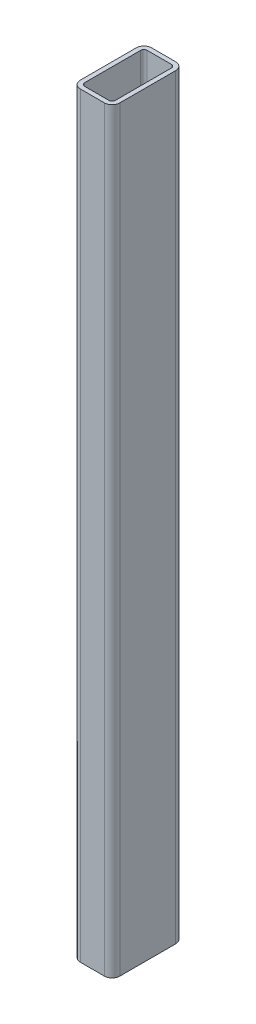
ISO-10303-21;
HEADER;
FILE_DESCRIPTION(('STEP AP214'),'2;1');
FILE_NAME('part.step','',(''),(''),'','','');
FILE_SCHEMA(('AUTOMOTIVE_DESIGN { 1 0 10303 214 1 1 1 1 }'));
ENDSEC;
DATA;
#1=APPLICATION_CONTEXT('core data for automotive mechanical design processes');
#2=APPLICATION_PROTOCOL_DEFINITION('international standard','automotive_design',2000,#1);
#3=PRODUCT_CONTEXT('',#1,'mechanical');
#4=PRODUCT('Part','Part','',(#3));
#5=PRODUCT_RELATED_PRODUCT_CATEGORY('part','',(#4));
#6=PRODUCT_DEFINITION_FORMATION('','',#4);
#7=PRODUCT_DEFINITION_CONTEXT('part definition',#1,'design');
#8=PRODUCT_DEFINITION('design','',#6,#7);
#9=PRODUCT_DEFINITION_SHAPE('','',#8);
#10=(LENGTH_UNIT() NAMED_UNIT(*) SI_UNIT(.MILLI.,.METRE.));
#11=(NAMED_UNIT(*) PLANE_ANGLE_UNIT() SI_UNIT($,.RADIAN.));
#12=(NAMED_UNIT(*) SI_UNIT($,.STERADIAN.) SOLID_ANGLE_UNIT());
#13=UNCERTAINTY_MEASURE_WITH_UNIT(LENGTH_MEASURE(1.E-05),#10,'distance_accuracy_value','');
#14=(GEOMETRIC_REPRESENTATION_CONTEXT(3) GLOBAL_UNCERTAINTY_ASSIGNED_CONTEXT((#13)) GLOBAL_UNIT_ASSIGNED_CONTEXT((#10,
#11,#12)) REPRESENTATION_CONTEXT('',''));
#15=CARTESIAN_POINT('',(0.,0.,0.));
#16=DIRECTION('',(0.,0.,1.));
#17=DIRECTION('',(1.,0.,0.));
#18=AXIS2_PLACEMENT_3D('',#15,#16,#17);
#19=CARTESIAN_POINT('',(5.5,345.,-12.75));
#20=DIRECTION('',(0.,1.,0.));
#21=DIRECTION('',(0.,0.,1.));
#22=AXIS2_PLACEMENT_3D('',#19,#20,#21);
#23=PLANE('',#22);
#24=CARTESIAN_POINT('',(5.5,345.,-12.75));
#25=DIRECTION('',(0.,1.,0.));
#26=DIRECTION('',(1.,0.,0.));
#27=AXIS2_PLACEMENT_3D('',#24,#25,#26);
#28=CIRCLE('',#27,3.5);
#29=CARTESIAN_POINT('',(9.,345.,-12.75));
#30=VERTEX_POINT('',#29);
#31=CARTESIAN_POINT('',(5.5,345.,-16.25));
#32=VERTEX_POINT('',#31);
#33=EDGE_CURVE('E258',#30,#32,#28,.T.);
#34=ORIENTED_EDGE('',*,*,#33,.T.);
#35=DIRECTION('',(-1.,0.,0.));
#36=VECTOR('',#35,1.);
#37=CARTESIAN_POINT('',(-5.5,345.,-16.25));
#38=LINE('',#37,#36);
#39=CARTESIAN_POINT('',(-5.5,345.,-16.25));
#40=VERTEX_POINT('',#39);
#41=EDGE_CURVE('E261',#32,#40,#38,.T.);
#42=ORIENTED_EDGE('',*,*,#41,.T.);
#43=CARTESIAN_POINT('',(-5.5,345.,-12.75));
#44=DIRECTION('',(0.,1.,0.));
#45=DIRECTION('',(1.,0.,0.));
#46=AXIS2_PLACEMENT_3D('',#43,#44,#45);
#47=CIRCLE('',#46,3.5);
#48=CARTESIAN_POINT('',(-9.,345.,-12.75));
#49=VERTEX_POINT('',#48);
#50=EDGE_CURVE('E264',#40,#49,#47,.T.);
#51=ORIENTED_EDGE('',*,*,#50,.T.);
#52=DIRECTION('',(0.,0.,1.));
#53=VECTOR('',#52,1.);
#54=CARTESIAN_POINT('',(-9.,345.,-12.75));
#55=LINE('',#54,#53);
#56=CARTESIAN_POINT('',(-9.,345.,12.75));
#57=VERTEX_POINT('',#56);
#58=EDGE_CURVE('E266',#49,#57,#55,.T.);
#59=ORIENTED_EDGE('',*,*,#58,.T.);
#60=CARTESIAN_POINT('',(-5.5,345.,12.75));
#61=DIRECTION('',(0.,1.,0.));
#62=DIRECTION('',(1.,0.,0.));
#63=AXIS2_PLACEMENT_3D('',#60,#61,#62);
#64=CIRCLE('',#63,3.5);
#65=CARTESIAN_POINT('',(-5.5,345.,16.25));
#66=VERTEX_POINT('',#65);
#67=EDGE_CURVE('E268',#57,#66,#64,.T.);
#68=ORIENTED_EDGE('',*,*,#67,.T.);
#69=DIRECTION('',(1.,0.,0.));
#70=VECTOR('',#69,1.);
#71=CARTESIAN_POINT('',(-5.5,345.,16.25));
#72=LINE('',#71,#70);
#73=CARTESIAN_POINT('',(5.50000000000001,345.,16.25));
#74=VERTEX_POINT('',#73);
#75=EDGE_CURVE('E270',#66,#74,#72,.T.);
#76=ORIENTED_EDGE('',*,*,#75,.T.);
#77=CARTESIAN_POINT('',(5.5,345.,12.75));
#78=DIRECTION('',(0.,1.,0.));
#79=DIRECTION('',(1.,0.,0.));
#80=AXIS2_PLACEMENT_3D('',#77,#78,#79);
#81=CIRCLE('',#80,3.5);
#82=CARTESIAN_POINT('',(9.00000000000001,345.,12.75));
#83=VERTEX_POINT('',#82);
#84=EDGE_CURVE('E272',#74,#83,#81,.T.);
#85=ORIENTED_EDGE('',*,*,#84,.T.);
#86=DIRECTION('',(0.,0.,-1.));
#87=VECTOR('',#86,1.);
#88=CARTESIAN_POINT('',(9.,345.,-12.75));
#89=LINE('',#88,#87);
#90=EDGE_CURVE('E274',#83,#30,#89,.T.);
#91=ORIENTED_EDGE('',*,*,#90,.T.);
#92=EDGE_LOOP('',(#34,#42,#51,#59,#68,#76,#85,#91));
#93=FACE_BOUND('',#92,.T.);
#94=DIRECTION('',(-1.,0.,0.));
#95=VECTOR('',#94,1.);
#96=CARTESIAN_POINT('',(-5.5,345.,-14.25));
#97=LINE('',#96,#95);
#98=CARTESIAN_POINT('',(5.5,345.,-14.25));
#99=VERTEX_POINT('',#98);
#100=CARTESIAN_POINT('',(-5.5,345.,-14.25));
#101=VERTEX_POINT('',#100);
#102=EDGE_CURVE('E201',#99,#101,#97,.T.);
#103=ORIENTED_EDGE('',*,*,#102,.F.);
#104=CARTESIAN_POINT('',(5.5,345.,-12.75));
#105=DIRECTION('',(0.,1.,0.));
#106=DIRECTION('',(0.,0.,1.));
#107=AXIS2_PLACEMENT_3D('',#104,#105,#106);
#108=CIRCLE('',#107,1.5);
#109=CARTESIAN_POINT('',(7.,345.,-12.75));
#110=VERTEX_POINT('',#109);
#111=EDGE_CURVE('E193',#110,#99,#108,.T.);
#112=ORIENTED_EDGE('',*,*,#111,.F.);
#113=DIRECTION('',(0.,0.,-1.));
#114=VECTOR('',#113,1.);
#115=CARTESIAN_POINT('',(7.,345.,-12.75));
#116=LINE('',#115,#114);
#117=CARTESIAN_POINT('',(7.,345.,12.75));
#118=VERTEX_POINT('',#117);
#119=EDGE_CURVE('E226',#118,#110,#116,.T.);
#120=ORIENTED_EDGE('',*,*,#119,.F.);
#121=CARTESIAN_POINT('',(5.5,345.,12.75));
#122=DIRECTION('',(0.,1.,0.));
#123=DIRECTION('',(0.,0.,-1.));
#124=AXIS2_PLACEMENT_3D('',#121,#122,#123);
#125=CIRCLE('',#124,1.5);
#126=CARTESIAN_POINT('',(5.5,345.,14.25));
#127=VERTEX_POINT('',#126);
#128=EDGE_CURVE('E224',#127,#118,#125,.T.);
#129=ORIENTED_EDGE('',*,*,#128,.F.);
#130=DIRECTION('',(1.,0.,0.));
#131=VECTOR('',#130,1.);
#132=CARTESIAN_POINT('',(-5.5,345.,14.25));
#133=LINE('',#132,#131);
#134=CARTESIAN_POINT('',(-5.5,345.,14.25));
#135=VERTEX_POINT('',#134);
#136=EDGE_CURVE('E222',#135,#127,#133,.T.);
#137=ORIENTED_EDGE('',*,*,#136,.F.);
#138=CARTESIAN_POINT('',(-5.5,345.,12.75));
#139=DIRECTION('',(0.,1.,0.));
#140=DIRECTION('',(0.,0.,-1.));
#141=AXIS2_PLACEMENT_3D('',#138,#139,#140);
#142=CIRCLE('',#141,1.5);
#143=CARTESIAN_POINT('',(-7.,345.,12.75));
#144=VERTEX_POINT('',#143);
#145=EDGE_CURVE('E220',#144,#135,#142,.T.);
#146=ORIENTED_EDGE('',*,*,#145,.F.);
#147=DIRECTION('',(0.,0.,1.));
#148=VECTOR('',#147,1.);
#149=CARTESIAN_POINT('',(-7.,345.,-12.75));
#150=LINE('',#149,#148);
#151=CARTESIAN_POINT('',(-7.,345.,-12.75));
#152=VERTEX_POINT('',#151);
#153=EDGE_CURVE('E216',#152,#144,#150,.T.);
#154=ORIENTED_EDGE('',*,*,#153,.F.);
#155=CARTESIAN_POINT('',(-5.5,345.,-12.75));
#156=DIRECTION('',(0.,1.,0.));
#157=DIRECTION('',(0.,0.,1.));
#158=AXIS2_PLACEMENT_3D('',#155,#156,#157);
#159=CIRCLE('',#158,1.5);
#160=EDGE_CURVE('E214',#101,#152,#159,.T.);
#161=ORIENTED_EDGE('',*,*,#160,.F.);
#162=EDGE_LOOP('',(#103,#112,#120,#129,#137,#146,#154,#161));
#163=FACE_BOUND('',#162,.T.);
#164=ADVANCED_FACE('F80',(#93,#163),#23,.T.);
#165=CARTESIAN_POINT('',(5.5,0.,-12.75));
#166=DIRECTION('',(0.,1.,0.));
#167=DIRECTION('',(0.,0.,1.));
#168=AXIS2_PLACEMENT_3D('',#165,#166,#167);
#169=PLANE('',#168);
#170=CARTESIAN_POINT('',(5.5,0.,-12.75));
#171=DIRECTION('',(0.,1.,0.));
#172=DIRECTION('',(1.,0.,0.));
#173=AXIS2_PLACEMENT_3D('',#170,#171,#172);
#174=CIRCLE('',#173,3.5);
#175=CARTESIAN_POINT('',(9.,0.,-12.75));
#176=VERTEX_POINT('',#175);
#177=CARTESIAN_POINT('',(5.5,0.,-16.25));
#178=VERTEX_POINT('',#177);
#179=EDGE_CURVE('E209',#176,#178,#174,.T.);
#180=ORIENTED_EDGE('',*,*,#179,.F.);
#181=DIRECTION('',(0.,0.,-1.));
#182=VECTOR('',#181,1.);
#183=CARTESIAN_POINT('',(9.,0.,-12.75));
#184=LINE('',#183,#182);
#185=CARTESIAN_POINT('',(9.00000000000001,0.,12.75));
#186=VERTEX_POINT('',#185);
#187=EDGE_CURVE('E262',#186,#176,#184,.T.);
#188=ORIENTED_EDGE('',*,*,#187,.F.);
#189=CARTESIAN_POINT('',(5.5,0.,12.75));
#190=DIRECTION('',(0.,1.,0.));
#191=DIRECTION('',(1.,0.,0.));
#192=AXIS2_PLACEMENT_3D('',#189,#190,#191);
#193=CIRCLE('',#192,3.5);
#194=CARTESIAN_POINT('',(5.50000000000001,0.,16.25));
#195=VERTEX_POINT('',#194);
#196=EDGE_CURVE('E289',#195,#186,#193,.T.);
#197=ORIENTED_EDGE('',*,*,#196,.F.);
#198=DIRECTION('',(1.,0.,0.));
#199=VECTOR('',#198,1.);
#200=CARTESIAN_POINT('',(-5.5,0.,16.25));
#201=LINE('',#200,#199);
#202=CARTESIAN_POINT('',(-5.5,0.,16.25));
#203=VERTEX_POINT('',#202);
#204=EDGE_CURVE('E287',#203,#195,#201,.T.);
#205=ORIENTED_EDGE('',*,*,#204,.F.);
#206=CARTESIAN_POINT('',(-5.5,0.,12.75));
#207=DIRECTION('',(0.,1.,0.));
#208=DIRECTION('',(1.,0.,0.));
#209=AXIS2_PLACEMENT_3D('',#206,#207,#208);
#210=CIRCLE('',#209,3.5);
#211=CARTESIAN_POINT('',(-9.,0.,12.75));
#212=VERTEX_POINT('',#211);
#213=EDGE_CURVE('E285',#212,#203,#210,.T.);
#214=ORIENTED_EDGE('',*,*,#213,.F.);
#215=DIRECTION('',(0.,0.,1.));
#216=VECTOR('',#215,1.);
#217=CARTESIAN_POINT('',(-9.,0.,-12.75));
#218=LINE('',#217,#216);
#219=CARTESIAN_POINT('',(-9.,0.,-12.75));
#220=VERTEX_POINT('',#219);
#221=EDGE_CURVE('E283',#220,#212,#218,.T.);
#222=ORIENTED_EDGE('',*,*,#221,.F.);
#223=CARTESIAN_POINT('',(-5.5,0.,-12.75));
#224=DIRECTION('',(0.,1.,0.));
#225=DIRECTION('',(1.,0.,0.));
#226=AXIS2_PLACEMENT_3D('',#223,#224,#225);
#227=CIRCLE('',#226,3.5);
#228=CARTESIAN_POINT('',(-5.5,0.,-16.25));
#229=VERTEX_POINT('',#228);
#230=EDGE_CURVE('E281',#229,#220,#227,.T.);
#231=ORIENTED_EDGE('',*,*,#230,.F.);
#232=DIRECTION('',(-1.,0.,0.));
#233=VECTOR('',#232,1.);
#234=CARTESIAN_POINT('',(-5.5,0.,-16.25));
#235=LINE('',#234,#233);
#236=EDGE_CURVE('E279',#178,#229,#235,.T.);
#237=ORIENTED_EDGE('',*,*,#236,.F.);
#238=EDGE_LOOP('',(#180,#188,#197,#205,#214,#222,#231,#237));
#239=FACE_BOUND('',#238,.T.);
#240=CARTESIAN_POINT('',(5.5,0.,-12.75));
#241=DIRECTION('',(0.,1.,0.));
#242=DIRECTION('',(0.,0.,1.));
#243=AXIS2_PLACEMENT_3D('',#240,#241,#242);
#244=CIRCLE('',#243,1.5);
#245=CARTESIAN_POINT('',(7.,0.,-12.75));
#246=VERTEX_POINT('',#245);
#247=CARTESIAN_POINT('',(5.5,0.,-14.25));
#248=VERTEX_POINT('',#247);
#249=EDGE_CURVE('E103',#246,#248,#244,.T.);
#250=ORIENTED_EDGE('',*,*,#249,.T.);
#251=DIRECTION('',(-1.,0.,0.));
#252=VECTOR('',#251,1.);
#253=CARTESIAN_POINT('',(-5.5,0.,-14.25));
#254=LINE('',#253,#252);
#255=CARTESIAN_POINT('',(-5.5,0.,-14.25));
#256=VERTEX_POINT('',#255);
#257=EDGE_CURVE('E208',#248,#256,#254,.T.);
#258=ORIENTED_EDGE('',*,*,#257,.T.);
#259=CARTESIAN_POINT('',(-5.5,0.,-12.75));
#260=DIRECTION('',(0.,1.,0.));
#261=DIRECTION('',(0.,0.,1.));
#262=AXIS2_PLACEMENT_3D('',#259,#260,#261);
#263=CIRCLE('',#262,1.5);
#264=CARTESIAN_POINT('',(-7.,0.,-12.75));
#265=VERTEX_POINT('',#264);
#266=EDGE_CURVE('E230',#256,#265,#263,.T.);
#267=ORIENTED_EDGE('',*,*,#266,.T.);
#268=DIRECTION('',(0.,0.,1.));
#269=VECTOR('',#268,1.);
#270=CARTESIAN_POINT('',(-7.,0.,-12.75));
#271=LINE('',#270,#269);
#272=CARTESIAN_POINT('',(-7.,0.,12.75));
#273=VERTEX_POINT('',#272);
#274=EDGE_CURVE('E233',#265,#273,#271,.T.);
#275=ORIENTED_EDGE('',*,*,#274,.T.);
#276=CARTESIAN_POINT('',(-5.5,0.,12.75));
#277=DIRECTION('',(0.,1.,0.));
#278=DIRECTION('',(0.,0.,-1.));
#279=AXIS2_PLACEMENT_3D('',#276,#277,#278);
#280=CIRCLE('',#279,1.5);
#281=CARTESIAN_POINT('',(-5.5,0.,14.25));
#282=VERTEX_POINT('',#281);
#283=EDGE_CURVE('E236',#273,#282,#280,.T.);
#284=ORIENTED_EDGE('',*,*,#283,.T.);
#285=DIRECTION('',(1.,0.,0.));
#286=VECTOR('',#285,1.);
#287=CARTESIAN_POINT('',(-5.5,0.,14.25));
#288=LINE('',#287,#286);
#289=CARTESIAN_POINT('',(5.5,0.,14.25));
#290=VERTEX_POINT('',#289);
#291=EDGE_CURVE('E239',#282,#290,#288,.T.);
#292=ORIENTED_EDGE('',*,*,#291,.T.);
#293=CARTESIAN_POINT('',(5.5,0.,12.75));
#294=DIRECTION('',(0.,1.,0.));
#295=DIRECTION('',(0.,0.,-1.));
#296=AXIS2_PLACEMENT_3D('',#293,#294,#295);
#297=CIRCLE('',#296,1.5);
#298=CARTESIAN_POINT('',(7.,0.,12.75));
#299=VERTEX_POINT('',#298);
#300=EDGE_CURVE('E242',#290,#299,#297,.T.);
#301=ORIENTED_EDGE('',*,*,#300,.T.);
#302=DIRECTION('',(0.,0.,-1.));
#303=VECTOR('',#302,1.);
#304=CARTESIAN_POINT('',(7.,0.,-12.75));
#305=LINE('',#304,#303);
#306=EDGE_CURVE('E202',#299,#246,#305,.T.);
#307=ORIENTED_EDGE('',*,*,#306,.T.);
#308=EDGE_LOOP('',(#250,#258,#267,#275,#284,#292,#301,#307));
#309=FACE_BOUND('',#308,.T.);
#310=ADVANCED_FACE('F319',(#239,#309),#169,.F.);
#311=CARTESIAN_POINT('',(5.5,345.,-12.75));
#312=DIRECTION('',(0.,-1.,0.));
#313=DIRECTION('',(0.,0.,-1.));
#314=AXIS2_PLACEMENT_3D('',#311,#312,#313);
#315=CYLINDRICAL_SURFACE('',#314,3.5);
#316=ORIENTED_EDGE('',*,*,#179,.T.);
#317=DIRECTION('',(0.,-1.,0.));
#318=VECTOR('',#317,1.);
#319=CARTESIAN_POINT('',(5.5,345.,-16.25));
#320=LINE('',#319,#318);
#321=EDGE_CURVE('E12',#32,#178,#320,.T.);
#322=ORIENTED_EDGE('',*,*,#321,.F.);
#323=ORIENTED_EDGE('',*,*,#33,.F.);
#324=DIRECTION('',(0.,-1.,0.));
#325=VECTOR('',#324,1.);
#326=CARTESIAN_POINT('',(9.,345.,-12.75));
#327=LINE('',#326,#325);
#328=EDGE_CURVE('E276',#30,#176,#327,.T.);
#329=ORIENTED_EDGE('',*,*,#328,.T.);
#330=EDGE_LOOP('',(#316,#322,#323,#329));
#331=FACE_BOUND('',#330,.T.);
#332=ADVANCED_FACE('F82',(#331),#315,.T.);
#333=CARTESIAN_POINT('',(-5.5,345.,-16.25));
#334=DIRECTION('',(0.,0.,1.));
#335=DIRECTION('',(1.,0.,0.));
#336=AXIS2_PLACEMENT_3D('',#333,#334,#335);
#337=PLANE('',#336);
#338=ORIENTED_EDGE('',*,*,#236,.T.);
#339=DIRECTION('',(0.,-1.,0.));
#340=VECTOR('',#339,1.);
#341=CARTESIAN_POINT('',(-5.5,345.,-16.25));
#342=LINE('',#341,#340);
#343=EDGE_CURVE('E88',#40,#229,#342,.T.);
#344=ORIENTED_EDGE('',*,*,#343,.F.);
#345=ORIENTED_EDGE('',*,*,#41,.F.);
#346=ORIENTED_EDGE('',*,*,#321,.T.);
#347=EDGE_LOOP('',(#338,#344,#345,#346));
#348=FACE_BOUND('',#347,.T.);
#349=ADVANCED_FACE('F336',(#348),#337,.F.);
#350=CARTESIAN_POINT('',(-5.5,345.,-12.75));
#351=DIRECTION('',(0.,-1.,0.));
#352=DIRECTION('',(0.,0.,-1.));
#353=AXIS2_PLACEMENT_3D('',#350,#351,#352);
#354=CYLINDRICAL_SURFACE('',#353,3.5);
#355=ORIENTED_EDGE('',*,*,#230,.T.);
#356=DIRECTION('',(0.,-1.,0.));
#357=VECTOR('',#356,1.);
#358=CARTESIAN_POINT('',(-9.,345.,-12.75));
#359=LINE('',#358,#357);
#360=EDGE_CURVE('E306',#49,#220,#359,.T.);
#361=ORIENTED_EDGE('',*,*,#360,.F.);
#362=ORIENTED_EDGE('',*,*,#50,.F.);
#363=ORIENTED_EDGE('',*,*,#343,.T.);
#364=EDGE_LOOP('',(#355,#361,#362,#363));
#365=FACE_BOUND('',#364,.T.);
#366=ADVANCED_FACE('F313',(#365),#354,.T.);
#367=CARTESIAN_POINT('',(-9.,345.,-12.75));
#368=DIRECTION('',(1.,0.,0.));
#369=DIRECTION('',(0.,0.,-1.));
#370=AXIS2_PLACEMENT_3D('',#367,#368,#369);
#371=PLANE('',#370);
#372=ORIENTED_EDGE('',*,*,#221,.T.);
#373=DIRECTION('',(0.,-1.,0.));
#374=VECTOR('',#373,1.);
#375=CARTESIAN_POINT('',(-9.,345.,12.75));
#376=LINE('',#375,#374);
#377=EDGE_CURVE('E303',#57,#212,#376,.T.);
#378=ORIENTED_EDGE('',*,*,#377,.F.);
#379=ORIENTED_EDGE('',*,*,#58,.F.);
#380=ORIENTED_EDGE('',*,*,#360,.T.);
#381=EDGE_LOOP('',(#372,#378,#379,#380));
#382=FACE_BOUND('',#381,.T.);
#383=ADVANCED_FACE('F325',(#382),#371,.F.);
#384=CARTESIAN_POINT('',(-5.5,345.,12.75));
#385=DIRECTION('',(0.,-1.,0.));
#386=DIRECTION('',(0.,0.,-1.));
#387=AXIS2_PLACEMENT_3D('',#384,#385,#386);
#388=CYLINDRICAL_SURFACE('',#387,3.5);
#389=ORIENTED_EDGE('',*,*,#213,.T.);
#390=DIRECTION('',(0.,-1.,0.));
#391=VECTOR('',#390,1.);
#392=CARTESIAN_POINT('',(-5.5,345.,16.25));
#393=LINE('',#392,#391);
#394=EDGE_CURVE('E300',#66,#203,#393,.T.);
#395=ORIENTED_EDGE('',*,*,#394,.F.);
#396=ORIENTED_EDGE('',*,*,#67,.F.);
#397=ORIENTED_EDGE('',*,*,#377,.T.);
#398=EDGE_LOOP('',(#389,#395,#396,#397));
#399=FACE_BOUND('',#398,.T.);
#400=ADVANCED_FACE('F329',(#399),#388,.T.);
#401=CARTESIAN_POINT('',(-5.5,345.,16.25));
#402=DIRECTION('',(0.,0.,-1.));
#403=DIRECTION('',(-1.,0.,0.));
#404=AXIS2_PLACEMENT_3D('',#401,#402,#403);
#405=PLANE('',#404);
#406=ORIENTED_EDGE('',*,*,#204,.T.);
#407=DIRECTION('',(0.,-1.,0.));
#408=VECTOR('',#407,1.);
#409=CARTESIAN_POINT('',(5.50000000000001,345.,16.25));
#410=LINE('',#409,#408);
#411=EDGE_CURVE('E297',#74,#195,#410,.T.);
#412=ORIENTED_EDGE('',*,*,#411,.F.);
#413=ORIENTED_EDGE('',*,*,#75,.F.);
#414=ORIENTED_EDGE('',*,*,#394,.T.);
#415=EDGE_LOOP('',(#406,#412,#413,#414));
#416=FACE_BOUND('',#415,.T.);
#417=ADVANCED_FACE('F349',(#416),#405,.F.);
#418=CARTESIAN_POINT('',(5.5,345.,12.75));
#419=DIRECTION('',(0.,-1.,0.));
#420=DIRECTION('',(0.,0.,-1.));
#421=AXIS2_PLACEMENT_3D('',#418,#419,#420);
#422=CYLINDRICAL_SURFACE('',#421,3.5);
#423=ORIENTED_EDGE('',*,*,#196,.T.);
#424=DIRECTION('',(0.,-1.,0.));
#425=VECTOR('',#424,1.);
#426=CARTESIAN_POINT('',(9.00000000000001,345.,12.75));
#427=LINE('',#426,#425);
#428=EDGE_CURVE('E294',#83,#186,#427,.T.);
#429=ORIENTED_EDGE('',*,*,#428,.F.);
#430=ORIENTED_EDGE('',*,*,#84,.F.);
#431=ORIENTED_EDGE('',*,*,#411,.T.);
#432=EDGE_LOOP('',(#423,#429,#430,#431));
#433=FACE_BOUND('',#432,.T.);
#434=ADVANCED_FACE('F347',(#433),#422,.T.);
#435=CARTESIAN_POINT('',(9.,345.,-12.75));
#436=DIRECTION('',(-1.,0.,0.));
#437=DIRECTION('',(0.,0.,1.));
#438=AXIS2_PLACEMENT_3D('',#435,#436,#437);
#439=PLANE('',#438);
#440=ORIENTED_EDGE('',*,*,#187,.T.);
#441=ORIENTED_EDGE('',*,*,#328,.F.);
#442=ORIENTED_EDGE('',*,*,#90,.F.);
#443=ORIENTED_EDGE('',*,*,#428,.T.);
#444=EDGE_LOOP('',(#440,#441,#442,#443));
#445=FACE_BOUND('',#444,.T.);
#446=ADVANCED_FACE('F342',(#445),#439,.F.);
#447=CARTESIAN_POINT('',(5.5,345.,-12.75));
#448=DIRECTION('',(0.,-1.,0.));
#449=DIRECTION('',(0.,0.,-1.));
#450=AXIS2_PLACEMENT_3D('',#447,#448,#449);
#451=CYLINDRICAL_SURFACE('',#450,1.5);
#452=ORIENTED_EDGE('',*,*,#249,.F.);
#453=DIRECTION('',(0.,-1.,0.));
#454=VECTOR('',#453,1.);
#455=CARTESIAN_POINT('',(7.,345.,-12.75));
#456=LINE('',#455,#454);
#457=EDGE_CURVE('E197',#110,#246,#456,.T.);
#458=ORIENTED_EDGE('',*,*,#457,.F.);
#459=ORIENTED_EDGE('',*,*,#111,.T.);
#460=DIRECTION('',(0.,-1.,0.));
#461=VECTOR('',#460,1.);
#462=CARTESIAN_POINT('',(5.5,345.,-14.25));
#463=LINE('',#462,#461);
#464=EDGE_CURVE('E196',#99,#248,#463,.T.);
#465=ORIENTED_EDGE('',*,*,#464,.T.);
#466=EDGE_LOOP('',(#452,#458,#459,#465));
#467=FACE_BOUND('',#466,.T.);
#468=ADVANCED_FACE('F195',(#467),#451,.F.);
#469=CARTESIAN_POINT('',(-5.5,345.,-14.25));
#470=DIRECTION('',(0.,0.,1.));
#471=DIRECTION('',(1.,0.,0.));
#472=AXIS2_PLACEMENT_3D('',#469,#470,#471);
#473=PLANE('',#472);
#474=ORIENTED_EDGE('',*,*,#257,.F.);
#475=ORIENTED_EDGE('',*,*,#464,.F.);
#476=ORIENTED_EDGE('',*,*,#102,.T.);
#477=DIRECTION('',(0.,-1.,0.));
#478=VECTOR('',#477,1.);
#479=CARTESIAN_POINT('',(-5.5,345.,-14.25));
#480=LINE('',#479,#478);
#481=EDGE_CURVE('E210',#101,#256,#480,.T.);
#482=ORIENTED_EDGE('',*,*,#481,.T.);
#483=EDGE_LOOP('',(#474,#475,#476,#482));
#484=FACE_BOUND('',#483,.T.);
#485=ADVANCED_FACE('F205',(#484),#473,.T.);
#486=CARTESIAN_POINT('',(-5.5,345.,-12.75));
#487=DIRECTION('',(0.,-1.,0.));
#488=DIRECTION('',(0.,0.,-1.));
#489=AXIS2_PLACEMENT_3D('',#486,#487,#488);
#490=CYLINDRICAL_SURFACE('',#489,1.5);
#491=ORIENTED_EDGE('',*,*,#266,.F.);
#492=ORIENTED_EDGE('',*,*,#481,.F.);
#493=ORIENTED_EDGE('',*,*,#160,.T.);
#494=DIRECTION('',(0.,-1.,0.));
#495=VECTOR('',#494,1.);
#496=CARTESIAN_POINT('',(-7.,345.,-12.75));
#497=LINE('',#496,#495);
#498=EDGE_CURVE('E255',#152,#265,#497,.T.);
#499=ORIENTED_EDGE('',*,*,#498,.T.);
#500=EDGE_LOOP('',(#491,#492,#493,#499));
#501=FACE_BOUND('',#500,.T.);
#502=ADVANCED_FACE('F374',(#501),#490,.F.);
#503=CARTESIAN_POINT('',(-7.,345.,-12.75));
#504=DIRECTION('',(1.,0.,0.));
#505=DIRECTION('',(0.,0.,-1.));
#506=AXIS2_PLACEMENT_3D('',#503,#504,#505);
#507=PLANE('',#506);
#508=ORIENTED_EDGE('',*,*,#274,.F.);
#509=ORIENTED_EDGE('',*,*,#498,.F.);
#510=ORIENTED_EDGE('',*,*,#153,.T.);
#511=DIRECTION('',(0.,-1.,0.));
#512=VECTOR('',#511,1.);
#513=CARTESIAN_POINT('',(-7.,345.,12.75));
#514=LINE('',#513,#512);
#515=EDGE_CURVE('E253',#144,#273,#514,.T.);
#516=ORIENTED_EDGE('',*,*,#515,.T.);
#517=EDGE_LOOP('',(#508,#509,#510,#516));
#518=FACE_BOUND('',#517,.T.);
#519=ADVANCED_FACE('F378',(#518),#507,.T.);
#520=CARTESIAN_POINT('',(-5.5,345.,12.75));
#521=DIRECTION('',(0.,-1.,0.));
#522=DIRECTION('',(0.,0.,-1.));
#523=AXIS2_PLACEMENT_3D('',#520,#521,#522);
#524=CYLINDRICAL_SURFACE('',#523,1.5);
#525=ORIENTED_EDGE('',*,*,#283,.F.);
#526=ORIENTED_EDGE('',*,*,#515,.F.);
#527=ORIENTED_EDGE('',*,*,#145,.T.);
#528=DIRECTION('',(0.,-1.,0.));
#529=VECTOR('',#528,1.);
#530=CARTESIAN_POINT('',(-5.5,345.,14.25));
#531=LINE('',#530,#529);
#532=EDGE_CURVE('E251',#135,#282,#531,.T.);
#533=ORIENTED_EDGE('',*,*,#532,.T.);
#534=EDGE_LOOP('',(#525,#526,#527,#533));
#535=FACE_BOUND('',#534,.T.);
#536=ADVANCED_FACE('F384',(#535),#524,.F.);
#537=CARTESIAN_POINT('',(-5.5,345.,14.25));
#538=DIRECTION('',(0.,0.,-1.));
#539=DIRECTION('',(-1.,0.,0.));
#540=AXIS2_PLACEMENT_3D('',#537,#538,#539);
#541=PLANE('',#540);
#542=ORIENTED_EDGE('',*,*,#291,.F.);
#543=ORIENTED_EDGE('',*,*,#532,.F.);
#544=ORIENTED_EDGE('',*,*,#136,.T.);
#545=DIRECTION('',(0.,-1.,0.));
#546=VECTOR('',#545,1.);
#547=CARTESIAN_POINT('',(5.5,345.,14.25));
#548=LINE('',#547,#546);
#549=EDGE_CURVE('E249',#127,#290,#548,.T.);
#550=ORIENTED_EDGE('',*,*,#549,.T.);
#551=EDGE_LOOP('',(#542,#543,#544,#550));
#552=FACE_BOUND('',#551,.T.);
#553=ADVANCED_FACE('F388',(#552),#541,.T.);
#554=CARTESIAN_POINT('',(5.5,345.,12.75));
#555=DIRECTION('',(0.,-1.,0.));
#556=DIRECTION('',(0.,0.,-1.));
#557=AXIS2_PLACEMENT_3D('',#554,#555,#556);
#558=CYLINDRICAL_SURFACE('',#557,1.5);
#559=ORIENTED_EDGE('',*,*,#300,.F.);
#560=ORIENTED_EDGE('',*,*,#549,.F.);
#561=ORIENTED_EDGE('',*,*,#128,.T.);
#562=DIRECTION('',(0.,-1.,0.));
#563=VECTOR('',#562,1.);
#564=CARTESIAN_POINT('',(7.,345.,12.75));
#565=LINE('',#564,#563);
#566=EDGE_CURVE('E95',#118,#299,#565,.T.);
#567=ORIENTED_EDGE('',*,*,#566,.T.);
#568=EDGE_LOOP('',(#559,#560,#561,#567));
#569=FACE_BOUND('',#568,.T.);
#570=ADVANCED_FACE('F392',(#569),#558,.F.);
#571=CARTESIAN_POINT('',(7.,345.,-12.75));
#572=DIRECTION('',(-1.,0.,0.));
#573=DIRECTION('',(0.,0.,1.));
#574=AXIS2_PLACEMENT_3D('',#571,#572,#573);
#575=PLANE('',#574);
#576=ORIENTED_EDGE('',*,*,#306,.F.);
#577=ORIENTED_EDGE('',*,*,#566,.F.);
#578=ORIENTED_EDGE('',*,*,#119,.T.);
#579=ORIENTED_EDGE('',*,*,#457,.T.);
#580=EDGE_LOOP('',(#576,#577,#578,#579));
#581=FACE_BOUND('',#580,.T.);
#582=ADVANCED_FACE('F396',(#581),#575,.T.);
#583=CLOSED_SHELL('',(#164,#310,#332,#349,#366,#383,#400,#417,#434,#446,#468,#485,#502,#519,
#536,#553,#570,#582));
#584=MANIFOLD_SOLID_BREP('B2',#583);
#585=ADVANCED_BREP_SHAPE_REPRESENTATION('',(#18,#584),#14);
#586=SHAPE_DEFINITION_REPRESENTATION(#9,#585);
ENDSEC;
END-ISO-10303-21;
